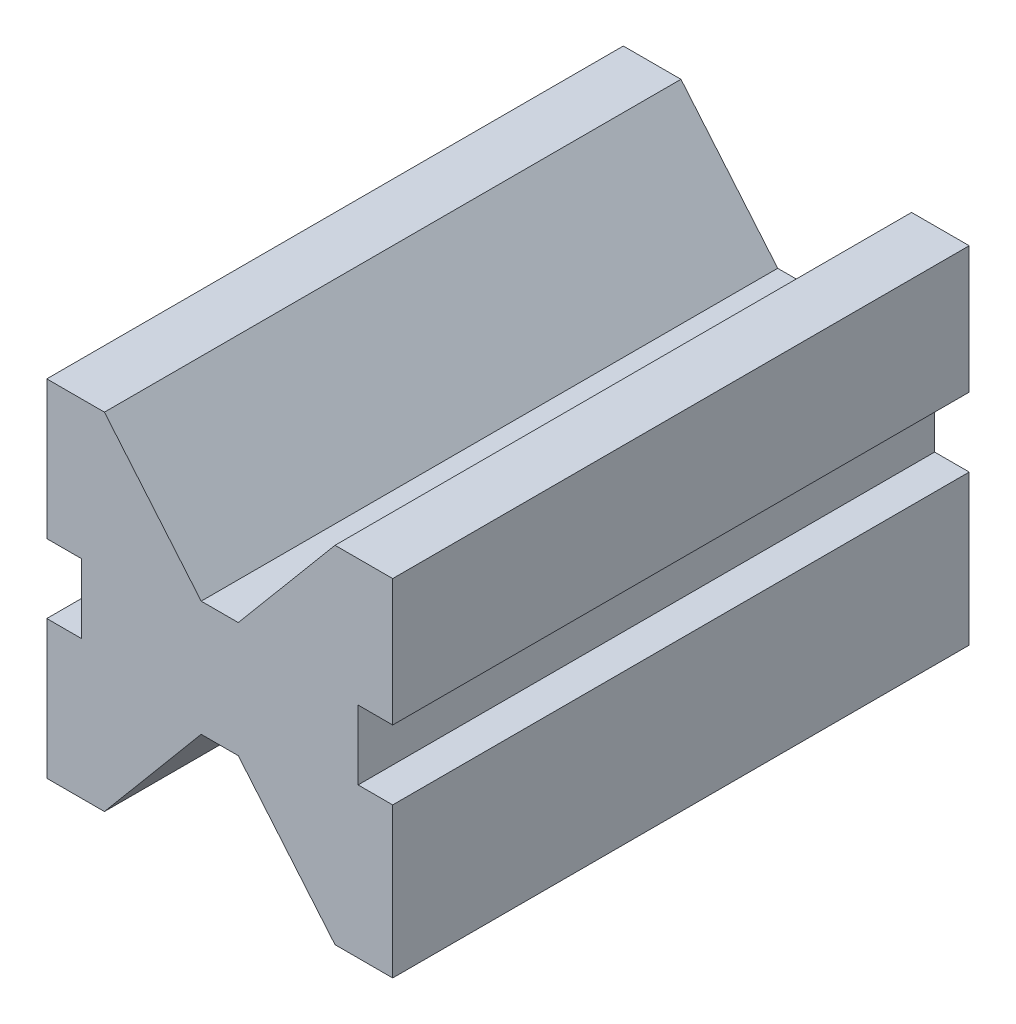
ISO-10303-21;
HEADER;
FILE_DESCRIPTION(('STEP AP214'),'2;1');
FILE_NAME('part.step','',(''),(''),'','','');
FILE_SCHEMA(('AUTOMOTIVE_DESIGN { 1 0 10303 214 1 1 1 1 }'));
ENDSEC;
DATA;
#1=APPLICATION_CONTEXT('core data for automotive mechanical design processes');
#2=APPLICATION_PROTOCOL_DEFINITION('international standard','automotive_design',2000,#1);
#3=PRODUCT_CONTEXT('',#1,'mechanical');
#4=PRODUCT('Part','Part','',(#3));
#5=PRODUCT_RELATED_PRODUCT_CATEGORY('part','',(#4));
#6=PRODUCT_DEFINITION_FORMATION('','',#4);
#7=PRODUCT_DEFINITION_CONTEXT('part definition',#1,'design');
#8=PRODUCT_DEFINITION('design','',#6,#7);
#9=PRODUCT_DEFINITION_SHAPE('','',#8);
#10=(LENGTH_UNIT() NAMED_UNIT(*) SI_UNIT(.MILLI.,.METRE.));
#11=(NAMED_UNIT(*) PLANE_ANGLE_UNIT() SI_UNIT($,.RADIAN.));
#12=(NAMED_UNIT(*) SI_UNIT($,.STERADIAN.) SOLID_ANGLE_UNIT());
#13=UNCERTAINTY_MEASURE_WITH_UNIT(LENGTH_MEASURE(1.E-05),#10,'distance_accuracy_value','');
#14=(GEOMETRIC_REPRESENTATION_CONTEXT(3) GLOBAL_UNCERTAINTY_ASSIGNED_CONTEXT((#13)) GLOBAL_UNIT_ASSIGNED_CONTEXT((#10,
#11,#12)) REPRESENTATION_CONTEXT('',''));
#15=CARTESIAN_POINT('',(0.,0.,0.));
#16=DIRECTION('',(0.,0.,1.));
#17=DIRECTION('',(1.,0.,0.));
#18=AXIS2_PLACEMENT_3D('',#15,#16,#17);
#19=CARTESIAN_POINT('',(0.,0.,100.));
#20=DIRECTION('',(-1.,0.,0.));
#21=DIRECTION('',(0.,0.,1.));
#22=AXIS2_PLACEMENT_3D('',#19,#20,#21);
#23=PLANE('',#22);
#24=DIRECTION('',(0.,1.,0.));
#25=VECTOR('',#24,1.);
#26=CARTESIAN_POINT('',(0.,0.,0.));
#27=LINE('',#26,#25);
#28=CARTESIAN_POINT('',(0.,0.,0.));
#29=VERTEX_POINT('',#28);
#30=CARTESIAN_POINT('',(0.,26.0025547445256,0.));
#31=VERTEX_POINT('',#30);
#32=EDGE_CURVE('E222',#29,#31,#27,.T.);
#33=ORIENTED_EDGE('',*,*,#32,.T.);
#34=DIRECTION('',(0.,0.,-1.));
#35=VECTOR('',#34,1.);
#36=CARTESIAN_POINT('',(0.,26.0025547445256,100.));
#37=LINE('',#36,#35);
#38=CARTESIAN_POINT('',(0.,26.0025547445256,100.));
#39=VERTEX_POINT('',#38);
#40=EDGE_CURVE('E11',#39,#31,#37,.T.);
#41=ORIENTED_EDGE('',*,*,#40,.F.);
#42=DIRECTION('',(0.,1.,0.));
#43=VECTOR('',#42,1.);
#44=CARTESIAN_POINT('',(0.,0.,100.));
#45=LINE('',#44,#43);
#46=CARTESIAN_POINT('',(0.,0.,100.));
#47=VERTEX_POINT('',#46);
#48=EDGE_CURVE('E280',#47,#39,#45,.T.);
#49=ORIENTED_EDGE('',*,*,#48,.F.);
#50=DIRECTION('',(0.,0.,-1.));
#51=VECTOR('',#50,1.);
#52=CARTESIAN_POINT('',(0.,0.,100.));
#53=LINE('',#52,#51);
#54=EDGE_CURVE('E218',#47,#29,#53,.T.);
#55=ORIENTED_EDGE('',*,*,#54,.T.);
#56=EDGE_LOOP('',(#33,#41,#49,#55));
#57=FACE_BOUND('',#56,.T.);
#58=ADVANCED_FACE('F49',(#57),#23,.F.);
#59=CARTESIAN_POINT('',(0.,26.0025547445256,100.));
#60=DIRECTION('',(0.,-1.,0.));
#61=DIRECTION('',(0.,0.,-1.));
#62=AXIS2_PLACEMENT_3D('',#59,#60,#61);
#63=PLANE('',#62);
#64=DIRECTION('',(-1.,0.,0.));
#65=VECTOR('',#64,1.);
#66=CARTESIAN_POINT('',(0.,26.0025547445256,0.));
#67=LINE('',#66,#65);
#68=CARTESIAN_POINT('',(-6.,26.0025547445256,0.));
#69=VERTEX_POINT('',#68);
#70=EDGE_CURVE('E226',#31,#69,#67,.T.);
#71=ORIENTED_EDGE('',*,*,#70,.T.);
#72=DIRECTION('',(0.,0.,-1.));
#73=VECTOR('',#72,1.);
#74=CARTESIAN_POINT('',(-6.,26.0025547445256,100.));
#75=LINE('',#74,#73);
#76=CARTESIAN_POINT('',(-6.,26.0025547445256,100.));
#77=VERTEX_POINT('',#76);
#78=EDGE_CURVE('E58',#77,#69,#75,.T.);
#79=ORIENTED_EDGE('',*,*,#78,.F.);
#80=DIRECTION('',(-1.,0.,0.));
#81=VECTOR('',#80,1.);
#82=CARTESIAN_POINT('',(0.,26.0025547445256,100.));
#83=LINE('',#82,#81);
#84=EDGE_CURVE('E145',#39,#77,#83,.T.);
#85=ORIENTED_EDGE('',*,*,#84,.F.);
#86=ORIENTED_EDGE('',*,*,#40,.T.);
#87=EDGE_LOOP('',(#71,#79,#85,#86));
#88=FACE_BOUND('',#87,.T.);
#89=ADVANCED_FACE('F430',(#88),#63,.F.);
#90=CARTESIAN_POINT('',(-6.,26.0025547445256,100.));
#91=DIRECTION('',(-1.,0.,0.));
#92=DIRECTION('',(0.,0.,1.));
#93=AXIS2_PLACEMENT_3D('',#90,#91,#92);
#94=PLANE('',#93);
#95=DIRECTION('',(0.,1.,0.));
#96=VECTOR('',#95,1.);
#97=CARTESIAN_POINT('',(-6.,26.0025547445256,0.));
#98=LINE('',#97,#96);
#99=CARTESIAN_POINT('',(-6.,38.0025547445255,0.));
#100=VERTEX_POINT('',#99);
#101=EDGE_CURVE('E229',#69,#100,#98,.T.);
#102=ORIENTED_EDGE('',*,*,#101,.T.);
#103=DIRECTION('',(0.,0.,-1.));
#104=VECTOR('',#103,1.);
#105=CARTESIAN_POINT('',(-6.,38.0025547445255,100.));
#106=LINE('',#105,#104);
#107=CARTESIAN_POINT('',(-6.,38.0025547445255,100.));
#108=VERTEX_POINT('',#107);
#109=EDGE_CURVE('E339',#108,#100,#106,.T.);
#110=ORIENTED_EDGE('',*,*,#109,.F.);
#111=DIRECTION('',(0.,1.,0.));
#112=VECTOR('',#111,1.);
#113=CARTESIAN_POINT('',(-6.,26.0025547445256,100.));
#114=LINE('',#113,#112);
#115=EDGE_CURVE('E349',#77,#108,#114,.T.);
#116=ORIENTED_EDGE('',*,*,#115,.F.);
#117=ORIENTED_EDGE('',*,*,#78,.T.);
#118=EDGE_LOOP('',(#102,#110,#116,#117));
#119=FACE_BOUND('',#118,.T.);
#120=ADVANCED_FACE('F347',(#119),#94,.F.);
#121=CARTESIAN_POINT('',(0.,38.0025547445255,100.));
#122=DIRECTION('',(0.,1.,0.));
#123=DIRECTION('',(0.,0.,1.));
#124=AXIS2_PLACEMENT_3D('',#121,#122,#123);
#125=PLANE('',#124);
#126=DIRECTION('',(1.,0.,0.));
#127=VECTOR('',#126,1.);
#128=CARTESIAN_POINT('',(0.,38.0025547445255,0.));
#129=LINE('',#128,#127);
#130=CARTESIAN_POINT('',(0.,38.0025547445255,0.));
#131=VERTEX_POINT('',#130);
#132=EDGE_CURVE('E232',#100,#131,#129,.T.);
#133=ORIENTED_EDGE('',*,*,#132,.T.);
#134=DIRECTION('',(0.,0.,-1.));
#135=VECTOR('',#134,1.);
#136=CARTESIAN_POINT('',(0.,38.0025547445255,100.));
#137=LINE('',#136,#135);
#138=CARTESIAN_POINT('',(0.,38.0025547445255,100.));
#139=VERTEX_POINT('',#138);
#140=EDGE_CURVE('E335',#139,#131,#137,.T.);
#141=ORIENTED_EDGE('',*,*,#140,.F.);
#142=DIRECTION('',(1.,0.,0.));
#143=VECTOR('',#142,1.);
#144=CARTESIAN_POINT('',(0.,38.0025547445255,100.));
#145=LINE('',#144,#143);
#146=EDGE_CURVE('E368',#108,#139,#145,.T.);
#147=ORIENTED_EDGE('',*,*,#146,.F.);
#148=ORIENTED_EDGE('',*,*,#109,.T.);
#149=EDGE_LOOP('',(#133,#141,#147,#148));
#150=FACE_BOUND('',#149,.T.);
#151=ADVANCED_FACE('F358',(#150),#125,.F.);
#152=CARTESIAN_POINT('',(0.,38.0025547445255,100.));
#153=DIRECTION('',(-1.,0.,0.));
#154=DIRECTION('',(0.,0.,1.));
#155=AXIS2_PLACEMENT_3D('',#152,#153,#154);
#156=PLANE('',#155);
#157=DIRECTION('',(0.,1.,0.));
#158=VECTOR('',#157,1.);
#159=CARTESIAN_POINT('',(0.,38.0025547445255,0.));
#160=LINE('',#159,#158);
#161=CARTESIAN_POINT('',(0.,60.,0.));
#162=VERTEX_POINT('',#161);
#163=EDGE_CURVE('E235',#131,#162,#160,.T.);
#164=ORIENTED_EDGE('',*,*,#163,.T.);
#165=DIRECTION('',(0.,0.,-1.));
#166=VECTOR('',#165,1.);
#167=CARTESIAN_POINT('',(0.,60.,100.));
#168=LINE('',#167,#166);
#169=CARTESIAN_POINT('',(0.,60.,100.));
#170=VERTEX_POINT('',#169);
#171=EDGE_CURVE('E331',#170,#162,#168,.T.);
#172=ORIENTED_EDGE('',*,*,#171,.F.);
#173=DIRECTION('',(0.,1.,0.));
#174=VECTOR('',#173,1.);
#175=CARTESIAN_POINT('',(0.,38.0025547445255,100.));
#176=LINE('',#175,#174);
#177=EDGE_CURVE('E364',#139,#170,#176,.T.);
#178=ORIENTED_EDGE('',*,*,#177,.F.);
#179=ORIENTED_EDGE('',*,*,#140,.T.);
#180=EDGE_LOOP('',(#164,#172,#178,#179));
#181=FACE_BOUND('',#180,.T.);
#182=ADVANCED_FACE('F362',(#181),#156,.F.);
#183=CARTESIAN_POINT('',(0.,60.,100.));
#184=DIRECTION('',(0.,-1.,0.));
#185=DIRECTION('',(0.,0.,-1.));
#186=AXIS2_PLACEMENT_3D('',#183,#184,#185);
#187=PLANE('',#186);
#188=DIRECTION('',(-1.,0.,0.));
#189=VECTOR('',#188,1.);
#190=CARTESIAN_POINT('',(0.,60.,0.));
#191=LINE('',#190,#189);
#192=CARTESIAN_POINT('',(-10.,60.,0.));
#193=VERTEX_POINT('',#192);
#194=EDGE_CURVE('E238',#162,#193,#191,.T.);
#195=ORIENTED_EDGE('',*,*,#194,.T.);
#196=DIRECTION('',(0.,0.,-1.));
#197=VECTOR('',#196,1.);
#198=CARTESIAN_POINT('',(-10.,60.,100.));
#199=LINE('',#198,#197);
#200=CARTESIAN_POINT('',(-10.,60.,100.));
#201=VERTEX_POINT('',#200);
#202=EDGE_CURVE('E327',#201,#193,#199,.T.);
#203=ORIENTED_EDGE('',*,*,#202,.F.);
#204=DIRECTION('',(-1.,0.,0.));
#205=VECTOR('',#204,1.);
#206=CARTESIAN_POINT('',(0.,60.,100.));
#207=LINE('',#206,#205);
#208=EDGE_CURVE('E367',#170,#201,#207,.T.);
#209=ORIENTED_EDGE('',*,*,#208,.F.);
#210=ORIENTED_EDGE('',*,*,#171,.T.);
#211=EDGE_LOOP('',(#195,#203,#209,#210));
#212=FACE_BOUND('',#211,.T.);
#213=ADVANCED_FACE('F443',(#212),#187,.F.);
#214=CARTESIAN_POINT('',(-26.7819926235458,40.,100.));
#215=DIRECTION('',(0.766044443118975,-0.642787609686543,0.));
#216=DIRECTION('',(0.642787609686543,0.766044443118975,0.));
#217=AXIS2_PLACEMENT_3D('',#214,#215,#216);
#218=PLANE('',#217);
#219=DIRECTION('',(-0.642787609686543,-0.766044443118975,0.));
#220=VECTOR('',#219,1.);
#221=CARTESIAN_POINT('',(-26.7819926235458,40.,0.));
#222=LINE('',#221,#220);
#223=CARTESIAN_POINT('',(-26.7819926235458,40.,0.));
#224=VERTEX_POINT('',#223);
#225=EDGE_CURVE('E241',#193,#224,#222,.T.);
#226=ORIENTED_EDGE('',*,*,#225,.T.);
#227=DIRECTION('',(0.,0.,-1.));
#228=VECTOR('',#227,1.);
#229=CARTESIAN_POINT('',(-26.7819926235458,40.,100.));
#230=LINE('',#229,#228);
#231=CARTESIAN_POINT('',(-26.7819926235458,40.,100.));
#232=VERTEX_POINT('',#231);
#233=EDGE_CURVE('E323',#232,#224,#230,.T.);
#234=ORIENTED_EDGE('',*,*,#233,.F.);
#235=DIRECTION('',(-0.642787609686543,-0.766044443118975,0.));
#236=VECTOR('',#235,1.);
#237=CARTESIAN_POINT('',(-26.7819926235458,40.,100.));
#238=LINE('',#237,#236);
#239=EDGE_CURVE('E372',#201,#232,#238,.T.);
#240=ORIENTED_EDGE('',*,*,#239,.F.);
#241=ORIENTED_EDGE('',*,*,#202,.T.);
#242=EDGE_LOOP('',(#226,#234,#240,#241));
#243=FACE_BOUND('',#242,.T.);
#244=ADVANCED_FACE('F446',(#243),#218,.F.);
#245=CARTESIAN_POINT('',(-33.2180073764542,40.,100.));
#246=DIRECTION('',(0.,-1.,0.));
#247=DIRECTION('',(0.,0.,-1.));
#248=AXIS2_PLACEMENT_3D('',#245,#246,#247);
#249=PLANE('',#248);
#250=DIRECTION('',(-1.,0.,0.));
#251=VECTOR('',#250,1.);
#252=CARTESIAN_POINT('',(-33.2180073764542,40.,0.));
#253=LINE('',#252,#251);
#254=CARTESIAN_POINT('',(-33.2180073764542,40.,0.));
#255=VERTEX_POINT('',#254);
#256=EDGE_CURVE('E244',#224,#255,#253,.T.);
#257=ORIENTED_EDGE('',*,*,#256,.T.);
#258=DIRECTION('',(0.,0.,-1.));
#259=VECTOR('',#258,1.);
#260=CARTESIAN_POINT('',(-33.2180073764542,40.,100.));
#261=LINE('',#260,#259);
#262=CARTESIAN_POINT('',(-33.2180073764542,40.,100.));
#263=VERTEX_POINT('',#262);
#264=EDGE_CURVE('E319',#263,#255,#261,.T.);
#265=ORIENTED_EDGE('',*,*,#264,.F.);
#266=DIRECTION('',(-1.,0.,0.));
#267=VECTOR('',#266,1.);
#268=CARTESIAN_POINT('',(-33.2180073764542,40.,100.));
#269=LINE('',#268,#267);
#270=EDGE_CURVE('E379',#232,#263,#269,.T.);
#271=ORIENTED_EDGE('',*,*,#270,.F.);
#272=ORIENTED_EDGE('',*,*,#233,.T.);
#273=EDGE_LOOP('',(#257,#265,#271,#272));
#274=FACE_BOUND('',#273,.T.);
#275=ADVANCED_FACE('F450',(#274),#249,.F.);
#276=CARTESIAN_POINT('',(-50.,60.,100.));
#277=DIRECTION('',(-0.766044443118975,-0.642787609686543,0.));
#278=DIRECTION('',(0.642787609686543,-0.766044443118975,0.));
#279=AXIS2_PLACEMENT_3D('',#276,#277,#278);
#280=PLANE('',#279);
#281=DIRECTION('',(-0.642787609686543,0.766044443118975,0.));
#282=VECTOR('',#281,1.);
#283=CARTESIAN_POINT('',(-50.,60.,0.));
#284=LINE('',#283,#282);
#285=CARTESIAN_POINT('',(-50.,60.,0.));
#286=VERTEX_POINT('',#285);
#287=EDGE_CURVE('E247',#255,#286,#284,.T.);
#288=ORIENTED_EDGE('',*,*,#287,.T.);
#289=DIRECTION('',(0.,0.,-1.));
#290=VECTOR('',#289,1.);
#291=CARTESIAN_POINT('',(-50.,60.,100.));
#292=LINE('',#291,#290);
#293=CARTESIAN_POINT('',(-50.,60.,100.));
#294=VERTEX_POINT('',#293);
#295=EDGE_CURVE('E315',#294,#286,#292,.T.);
#296=ORIENTED_EDGE('',*,*,#295,.F.);
#297=DIRECTION('',(-0.642787609686543,0.766044443118975,0.));
#298=VECTOR('',#297,1.);
#299=CARTESIAN_POINT('',(-50.,60.,100.));
#300=LINE('',#299,#298);
#301=EDGE_CURVE('E382',#263,#294,#300,.T.);
#302=ORIENTED_EDGE('',*,*,#301,.F.);
#303=ORIENTED_EDGE('',*,*,#264,.T.);
#304=EDGE_LOOP('',(#288,#296,#302,#303));
#305=FACE_BOUND('',#304,.T.);
#306=ADVANCED_FACE('F454',(#305),#280,.F.);
#307=CARTESIAN_POINT('',(-50.,60.,100.));
#308=DIRECTION('',(0.,-1.,0.));
#309=DIRECTION('',(1.,0.,0.));
#310=AXIS2_PLACEMENT_3D('',#307,#308,#309);
#311=PLANE('',#310);
#312=DIRECTION('',(-1.,0.,0.));
#313=VECTOR('',#312,1.);
#314=CARTESIAN_POINT('',(-50.,60.,0.));
#315=LINE('',#314,#313);
#316=CARTESIAN_POINT('',(-60.,60.,0.));
#317=VERTEX_POINT('',#316);
#318=EDGE_CURVE('E250',#286,#317,#315,.T.);
#319=ORIENTED_EDGE('',*,*,#318,.T.);
#320=DIRECTION('',(0.,0.,-1.));
#321=VECTOR('',#320,1.);
#322=CARTESIAN_POINT('',(-60.,60.,100.));
#323=LINE('',#322,#321);
#324=CARTESIAN_POINT('',(-60.,60.,100.));
#325=VERTEX_POINT('',#324);
#326=EDGE_CURVE('E311',#325,#317,#323,.T.);
#327=ORIENTED_EDGE('',*,*,#326,.F.);
#328=DIRECTION('',(-1.,0.,0.));
#329=VECTOR('',#328,1.);
#330=CARTESIAN_POINT('',(-50.,60.,100.));
#331=LINE('',#330,#329);
#332=EDGE_CURVE('E385',#294,#325,#331,.T.);
#333=ORIENTED_EDGE('',*,*,#332,.F.);
#334=ORIENTED_EDGE('',*,*,#295,.T.);
#335=EDGE_LOOP('',(#319,#327,#333,#334));
#336=FACE_BOUND('',#335,.T.);
#337=ADVANCED_FACE('F458',(#336),#311,.F.);
#338=CARTESIAN_POINT('',(-60.,36.,100.));
#339=DIRECTION('',(1.,0.,0.));
#340=DIRECTION('',(0.,0.,-1.));
#341=AXIS2_PLACEMENT_3D('',#338,#339,#340);
#342=PLANE('',#341);
#343=DIRECTION('',(0.,-1.,0.));
#344=VECTOR('',#343,1.);
#345=CARTESIAN_POINT('',(-60.,36.,0.));
#346=LINE('',#345,#344);
#347=CARTESIAN_POINT('',(-60.,36.,0.));
#348=VERTEX_POINT('',#347);
#349=EDGE_CURVE('E253',#317,#348,#346,.T.);
#350=ORIENTED_EDGE('',*,*,#349,.T.);
#351=DIRECTION('',(0.,0.,-1.));
#352=VECTOR('',#351,1.);
#353=CARTESIAN_POINT('',(-60.,36.,100.));
#354=LINE('',#353,#352);
#355=CARTESIAN_POINT('',(-60.,36.,100.));
#356=VERTEX_POINT('',#355);
#357=EDGE_CURVE('E307',#356,#348,#354,.T.);
#358=ORIENTED_EDGE('',*,*,#357,.F.);
#359=DIRECTION('',(0.,-1.,0.));
#360=VECTOR('',#359,1.);
#361=CARTESIAN_POINT('',(-60.,36.,100.));
#362=LINE('',#361,#360);
#363=EDGE_CURVE('E388',#325,#356,#362,.T.);
#364=ORIENTED_EDGE('',*,*,#363,.F.);
#365=ORIENTED_EDGE('',*,*,#326,.T.);
#366=EDGE_LOOP('',(#350,#358,#364,#365));
#367=FACE_BOUND('',#366,.T.);
#368=ADVANCED_FACE('F462',(#367),#342,.F.);
#369=CARTESIAN_POINT('',(-60.,36.,100.));
#370=DIRECTION('',(0.,1.,0.));
#371=DIRECTION('',(0.,0.,1.));
#372=AXIS2_PLACEMENT_3D('',#369,#370,#371);
#373=PLANE('',#372);
#374=DIRECTION('',(1.,0.,0.));
#375=VECTOR('',#374,1.);
#376=CARTESIAN_POINT('',(-60.,36.,0.));
#377=LINE('',#376,#375);
#378=CARTESIAN_POINT('',(-54.,36.,0.));
#379=VERTEX_POINT('',#378);
#380=EDGE_CURVE('E256',#348,#379,#377,.T.);
#381=ORIENTED_EDGE('',*,*,#380,.T.);
#382=DIRECTION('',(0.,0.,-1.));
#383=VECTOR('',#382,1.);
#384=CARTESIAN_POINT('',(-54.,36.,100.));
#385=LINE('',#384,#383);
#386=CARTESIAN_POINT('',(-54.,36.,100.));
#387=VERTEX_POINT('',#386);
#388=EDGE_CURVE('E303',#387,#379,#385,.T.);
#389=ORIENTED_EDGE('',*,*,#388,.F.);
#390=DIRECTION('',(1.,0.,0.));
#391=VECTOR('',#390,1.);
#392=CARTESIAN_POINT('',(-60.,36.,100.));
#393=LINE('',#392,#391);
#394=EDGE_CURVE('E391',#356,#387,#393,.T.);
#395=ORIENTED_EDGE('',*,*,#394,.F.);
#396=ORIENTED_EDGE('',*,*,#357,.T.);
#397=EDGE_LOOP('',(#381,#389,#395,#396));
#398=FACE_BOUND('',#397,.T.);
#399=ADVANCED_FACE('F466',(#398),#373,.F.);
#400=CARTESIAN_POINT('',(-54.,36.,100.));
#401=DIRECTION('',(1.,0.,0.));
#402=DIRECTION('',(0.,1.,0.));
#403=AXIS2_PLACEMENT_3D('',#400,#401,#402);
#404=PLANE('',#403);
#405=DIRECTION('',(0.,-1.,0.));
#406=VECTOR('',#405,1.);
#407=CARTESIAN_POINT('',(-54.,36.,0.));
#408=LINE('',#407,#406);
#409=CARTESIAN_POINT('',(-54.,24.,0.));
#410=VERTEX_POINT('',#409);
#411=EDGE_CURVE('E259',#379,#410,#408,.T.);
#412=ORIENTED_EDGE('',*,*,#411,.T.);
#413=DIRECTION('',(0.,0.,-1.));
#414=VECTOR('',#413,1.);
#415=CARTESIAN_POINT('',(-54.,24.,100.));
#416=LINE('',#415,#414);
#417=CARTESIAN_POINT('',(-54.,24.,100.));
#418=VERTEX_POINT('',#417);
#419=EDGE_CURVE('E299',#418,#410,#416,.T.);
#420=ORIENTED_EDGE('',*,*,#419,.F.);
#421=DIRECTION('',(0.,-1.,0.));
#422=VECTOR('',#421,1.);
#423=CARTESIAN_POINT('',(-54.,36.,100.));
#424=LINE('',#423,#422);
#425=EDGE_CURVE('E394',#387,#418,#424,.T.);
#426=ORIENTED_EDGE('',*,*,#425,.F.);
#427=ORIENTED_EDGE('',*,*,#388,.T.);
#428=EDGE_LOOP('',(#412,#420,#426,#427));
#429=FACE_BOUND('',#428,.T.);
#430=ADVANCED_FACE('F470',(#429),#404,.F.);
#431=CARTESIAN_POINT('',(-60.,24.,100.));
#432=DIRECTION('',(0.,-1.,0.));
#433=DIRECTION('',(1.,0.,0.));
#434=AXIS2_PLACEMENT_3D('',#431,#432,#433);
#435=PLANE('',#434);
#436=DIRECTION('',(-1.,0.,0.));
#437=VECTOR('',#436,1.);
#438=CARTESIAN_POINT('',(-60.,24.,0.));
#439=LINE('',#438,#437);
#440=CARTESIAN_POINT('',(-60.,24.,0.));
#441=VERTEX_POINT('',#440);
#442=EDGE_CURVE('E262',#410,#441,#439,.T.);
#443=ORIENTED_EDGE('',*,*,#442,.T.);
#444=DIRECTION('',(0.,0.,-1.));
#445=VECTOR('',#444,1.);
#446=CARTESIAN_POINT('',(-60.,24.,100.));
#447=LINE('',#446,#445);
#448=CARTESIAN_POINT('',(-60.,24.,100.));
#449=VERTEX_POINT('',#448);
#450=EDGE_CURVE('E295',#449,#441,#447,.T.);
#451=ORIENTED_EDGE('',*,*,#450,.F.);
#452=DIRECTION('',(-1.,0.,0.));
#453=VECTOR('',#452,1.);
#454=CARTESIAN_POINT('',(-60.,24.,100.));
#455=LINE('',#454,#453);
#456=EDGE_CURVE('E397',#418,#449,#455,.T.);
#457=ORIENTED_EDGE('',*,*,#456,.F.);
#458=ORIENTED_EDGE('',*,*,#419,.T.);
#459=EDGE_LOOP('',(#443,#451,#457,#458));
#460=FACE_BOUND('',#459,.T.);
#461=ADVANCED_FACE('F474',(#460),#435,.F.);
#462=CARTESIAN_POINT('',(-60.,0.,100.));
#463=DIRECTION('',(1.,0.,0.));
#464=DIRECTION('',(0.,0.,-1.));
#465=AXIS2_PLACEMENT_3D('',#462,#463,#464);
#466=PLANE('',#465);
#467=DIRECTION('',(0.,-1.,0.));
#468=VECTOR('',#467,1.);
#469=CARTESIAN_POINT('',(-60.,0.,0.));
#470=LINE('',#469,#468);
#471=CARTESIAN_POINT('',(-60.,0.,0.));
#472=VERTEX_POINT('',#471);
#473=EDGE_CURVE('E265',#441,#472,#470,.T.);
#474=ORIENTED_EDGE('',*,*,#473,.T.);
#475=DIRECTION('',(0.,0.,-1.));
#476=VECTOR('',#475,1.);
#477=CARTESIAN_POINT('',(-60.,0.,100.));
#478=LINE('',#477,#476);
#479=CARTESIAN_POINT('',(-60.,0.,100.));
#480=VERTEX_POINT('',#479);
#481=EDGE_CURVE('E291',#480,#472,#478,.T.);
#482=ORIENTED_EDGE('',*,*,#481,.F.);
#483=DIRECTION('',(0.,-1.,0.));
#484=VECTOR('',#483,1.);
#485=CARTESIAN_POINT('',(-60.,0.,100.));
#486=LINE('',#485,#484);
#487=EDGE_CURVE('E400',#449,#480,#486,.T.);
#488=ORIENTED_EDGE('',*,*,#487,.F.);
#489=ORIENTED_EDGE('',*,*,#450,.T.);
#490=EDGE_LOOP('',(#474,#482,#488,#489));
#491=FACE_BOUND('',#490,.T.);
#492=ADVANCED_FACE('F478',(#491),#466,.F.);
#493=CARTESIAN_POINT('',(-50.,0.,100.));
#494=DIRECTION('',(0.,1.,0.));
#495=DIRECTION('',(-1.,0.,0.));
#496=AXIS2_PLACEMENT_3D('',#493,#494,#495);
#497=PLANE('',#496);
#498=DIRECTION('',(1.,0.,0.));
#499=VECTOR('',#498,1.);
#500=CARTESIAN_POINT('',(-50.,0.,0.));
#501=LINE('',#500,#499);
#502=CARTESIAN_POINT('',(-50.,0.,0.));
#503=VERTEX_POINT('',#502);
#504=EDGE_CURVE('E268',#472,#503,#501,.T.);
#505=ORIENTED_EDGE('',*,*,#504,.T.);
#506=DIRECTION('',(0.,0.,-1.));
#507=VECTOR('',#506,1.);
#508=CARTESIAN_POINT('',(-50.,0.,100.));
#509=LINE('',#508,#507);
#510=CARTESIAN_POINT('',(-50.,0.,100.));
#511=VERTEX_POINT('',#510);
#512=EDGE_CURVE('E287',#511,#503,#509,.T.);
#513=ORIENTED_EDGE('',*,*,#512,.F.);
#514=DIRECTION('',(1.,0.,0.));
#515=VECTOR('',#514,1.);
#516=CARTESIAN_POINT('',(-50.,0.,100.));
#517=LINE('',#516,#515);
#518=EDGE_CURVE('E403',#480,#511,#517,.T.);
#519=ORIENTED_EDGE('',*,*,#518,.F.);
#520=ORIENTED_EDGE('',*,*,#481,.T.);
#521=EDGE_LOOP('',(#505,#513,#519,#520));
#522=FACE_BOUND('',#521,.T.);
#523=ADVANCED_FACE('F411',(#522),#497,.F.);
#524=CARTESIAN_POINT('',(-50.,0.,100.));
#525=DIRECTION('',(-0.766044443118975,0.642787609686543,0.));
#526=DIRECTION('',(-0.642787609686543,-0.766044443118975,0.));
#527=AXIS2_PLACEMENT_3D('',#524,#525,#526);
#528=PLANE('',#527);
#529=DIRECTION('',(0.642787609686543,0.766044443118975,0.));
#530=VECTOR('',#529,1.);
#531=CARTESIAN_POINT('',(-50.,0.,0.));
#532=LINE('',#531,#530);
#533=CARTESIAN_POINT('',(-33.2180073764542,20.,0.));
#534=VERTEX_POINT('',#533);
#535=EDGE_CURVE('E271',#503,#534,#532,.T.);
#536=ORIENTED_EDGE('',*,*,#535,.T.);
#537=DIRECTION('',(0.,0.,-1.));
#538=VECTOR('',#537,1.);
#539=CARTESIAN_POINT('',(-33.2180073764542,20.,100.));
#540=LINE('',#539,#538);
#541=CARTESIAN_POINT('',(-33.2180073764542,20.,100.));
#542=VERTEX_POINT('',#541);
#543=EDGE_CURVE('E211',#542,#534,#540,.T.);
#544=ORIENTED_EDGE('',*,*,#543,.F.);
#545=DIRECTION('',(0.642787609686543,0.766044443118975,0.));
#546=VECTOR('',#545,1.);
#547=CARTESIAN_POINT('',(-50.,0.,100.));
#548=LINE('',#547,#546);
#549=EDGE_CURVE('E200',#511,#542,#548,.T.);
#550=ORIENTED_EDGE('',*,*,#549,.F.);
#551=ORIENTED_EDGE('',*,*,#512,.T.);
#552=EDGE_LOOP('',(#536,#544,#550,#551));
#553=FACE_BOUND('',#552,.T.);
#554=ADVANCED_FACE('F415',(#553),#528,.F.);
#555=CARTESIAN_POINT('',(-33.2180073764542,20.,100.));
#556=DIRECTION('',(0.,1.,0.));
#557=DIRECTION('',(0.,0.,1.));
#558=AXIS2_PLACEMENT_3D('',#555,#556,#557);
#559=PLANE('',#558);
#560=DIRECTION('',(1.,0.,0.));
#561=VECTOR('',#560,1.);
#562=CARTESIAN_POINT('',(-33.2180073764542,20.,0.));
#563=LINE('',#562,#561);
#564=CARTESIAN_POINT('',(-26.7819926235458,20.,0.));
#565=VERTEX_POINT('',#564);
#566=EDGE_CURVE('E209',#534,#565,#563,.T.);
#567=ORIENTED_EDGE('',*,*,#566,.T.);
#568=DIRECTION('',(0.,0.,-1.));
#569=VECTOR('',#568,1.);
#570=CARTESIAN_POINT('',(-26.7819926235458,20.,100.));
#571=LINE('',#570,#569);
#572=CARTESIAN_POINT('',(-26.7819926235458,20.,100.));
#573=VERTEX_POINT('',#572);
#574=EDGE_CURVE('E206',#573,#565,#571,.T.);
#575=ORIENTED_EDGE('',*,*,#574,.F.);
#576=DIRECTION('',(1.,0.,0.));
#577=VECTOR('',#576,1.);
#578=CARTESIAN_POINT('',(-33.2180073764542,20.,100.));
#579=LINE('',#578,#577);
#580=EDGE_CURVE('E194',#542,#573,#579,.T.);
#581=ORIENTED_EDGE('',*,*,#580,.F.);
#582=ORIENTED_EDGE('',*,*,#543,.T.);
#583=EDGE_LOOP('',(#567,#575,#581,#582));
#584=FACE_BOUND('',#583,.T.);
#585=ADVANCED_FACE('F207',(#584),#559,.F.);
#586=CARTESIAN_POINT('',(-26.7819926235458,20.,100.));
#587=DIRECTION('',(0.766044443118975,0.642787609686543,0.));
#588=DIRECTION('',(-0.642787609686543,0.766044443118975,0.));
#589=AXIS2_PLACEMENT_3D('',#586,#587,#588);
#590=PLANE('',#589);
#591=DIRECTION('',(0.642787609686543,-0.766044443118975,0.));
#592=VECTOR('',#591,1.);
#593=CARTESIAN_POINT('',(-26.7819926235458,20.,0.));
#594=LINE('',#593,#592);
#595=CARTESIAN_POINT('',(-10.,0.,0.));
#596=VERTEX_POINT('',#595);
#597=EDGE_CURVE('E131',#565,#596,#594,.T.);
#598=ORIENTED_EDGE('',*,*,#597,.T.);
#599=DIRECTION('',(0.,0.,-1.));
#600=VECTOR('',#599,1.);
#601=CARTESIAN_POINT('',(-10.,0.,100.));
#602=LINE('',#601,#600);
#603=CARTESIAN_POINT('',(-10.,0.,100.));
#604=VERTEX_POINT('',#603);
#605=EDGE_CURVE('E212',#604,#596,#602,.T.);
#606=ORIENTED_EDGE('',*,*,#605,.F.);
#607=DIRECTION('',(0.642787609686543,-0.766044443118975,0.));
#608=VECTOR('',#607,1.);
#609=CARTESIAN_POINT('',(-26.7819926235458,20.,100.));
#610=LINE('',#609,#608);
#611=EDGE_CURVE('E198',#573,#604,#610,.T.);
#612=ORIENTED_EDGE('',*,*,#611,.F.);
#613=ORIENTED_EDGE('',*,*,#574,.T.);
#614=EDGE_LOOP('',(#598,#606,#612,#613));
#615=FACE_BOUND('',#614,.T.);
#616=ADVANCED_FACE('F214',(#615),#590,.F.);
#617=CARTESIAN_POINT('',(0.,0.,100.));
#618=DIRECTION('',(0.,1.,0.));
#619=DIRECTION('',(-1.,0.,0.));
#620=AXIS2_PLACEMENT_3D('',#617,#618,#619);
#621=PLANE('',#620);
#622=DIRECTION('',(1.,0.,0.));
#623=VECTOR('',#622,1.);
#624=CARTESIAN_POINT('',(0.,0.,0.));
#625=LINE('',#624,#623);
#626=EDGE_CURVE('E137',#596,#29,#625,.T.);
#627=ORIENTED_EDGE('',*,*,#626,.T.);
#628=ORIENTED_EDGE('',*,*,#54,.F.);
#629=DIRECTION('',(1.,0.,0.));
#630=VECTOR('',#629,1.);
#631=CARTESIAN_POINT('',(0.,0.,100.));
#632=LINE('',#631,#630);
#633=EDGE_CURVE('E66',#604,#47,#632,.T.);
#634=ORIENTED_EDGE('',*,*,#633,.F.);
#635=ORIENTED_EDGE('',*,*,#605,.T.);
#636=EDGE_LOOP('',(#627,#628,#634,#635));
#637=FACE_BOUND('',#636,.T.);
#638=ADVANCED_FACE('F419',(#637),#621,.F.);
#639=CARTESIAN_POINT('',(0.,0.,100.));
#640=DIRECTION('',(0.,0.,1.));
#641=DIRECTION('',(1.,0.,0.));
#642=AXIS2_PLACEMENT_3D('',#639,#640,#641);
#643=PLANE('',#642);
#644=ORIENTED_EDGE('',*,*,#48,.T.);
#645=ORIENTED_EDGE('',*,*,#84,.T.);
#646=ORIENTED_EDGE('',*,*,#115,.T.);
#647=ORIENTED_EDGE('',*,*,#146,.T.);
#648=ORIENTED_EDGE('',*,*,#177,.T.);
#649=ORIENTED_EDGE('',*,*,#208,.T.);
#650=ORIENTED_EDGE('',*,*,#239,.T.);
#651=ORIENTED_EDGE('',*,*,#270,.T.);
#652=ORIENTED_EDGE('',*,*,#301,.T.);
#653=ORIENTED_EDGE('',*,*,#332,.T.);
#654=ORIENTED_EDGE('',*,*,#363,.T.);
#655=ORIENTED_EDGE('',*,*,#394,.T.);
#656=ORIENTED_EDGE('',*,*,#425,.T.);
#657=ORIENTED_EDGE('',*,*,#456,.T.);
#658=ORIENTED_EDGE('',*,*,#487,.T.);
#659=ORIENTED_EDGE('',*,*,#518,.T.);
#660=ORIENTED_EDGE('',*,*,#549,.T.);
#661=ORIENTED_EDGE('',*,*,#580,.T.);
#662=ORIENTED_EDGE('',*,*,#611,.T.);
#663=ORIENTED_EDGE('',*,*,#633,.T.);
#664=EDGE_LOOP('',(#644,#645,#646,#647,#648,#649,#650,#651,#652,#653,#654,#655,#656,#657,#658,
#659,#660,#661,#662,#663));
#665=FACE_BOUND('',#664,.T.);
#666=ADVANCED_FACE('F196',(#665),#643,.T.);
#667=CARTESIAN_POINT('',(0.,0.,0.));
#668=DIRECTION('',(0.,0.,1.));
#669=DIRECTION('',(1.,0.,0.));
#670=AXIS2_PLACEMENT_3D('',#667,#668,#669);
#671=PLANE('',#670);
#672=ORIENTED_EDGE('',*,*,#32,.F.);
#673=ORIENTED_EDGE('',*,*,#626,.F.);
#674=ORIENTED_EDGE('',*,*,#597,.F.);
#675=ORIENTED_EDGE('',*,*,#566,.F.);
#676=ORIENTED_EDGE('',*,*,#535,.F.);
#677=ORIENTED_EDGE('',*,*,#504,.F.);
#678=ORIENTED_EDGE('',*,*,#473,.F.);
#679=ORIENTED_EDGE('',*,*,#442,.F.);
#680=ORIENTED_EDGE('',*,*,#411,.F.);
#681=ORIENTED_EDGE('',*,*,#380,.F.);
#682=ORIENTED_EDGE('',*,*,#349,.F.);
#683=ORIENTED_EDGE('',*,*,#318,.F.);
#684=ORIENTED_EDGE('',*,*,#287,.F.);
#685=ORIENTED_EDGE('',*,*,#256,.F.);
#686=ORIENTED_EDGE('',*,*,#225,.F.);
#687=ORIENTED_EDGE('',*,*,#194,.F.);
#688=ORIENTED_EDGE('',*,*,#163,.F.);
#689=ORIENTED_EDGE('',*,*,#132,.F.);
#690=ORIENTED_EDGE('',*,*,#101,.F.);
#691=ORIENTED_EDGE('',*,*,#70,.F.);
#692=EDGE_LOOP('',(#672,#673,#674,#675,#676,#677,#678,#679,#680,#681,#682,#683,#684,#685,#686,
#687,#688,#689,#690,#691));
#693=FACE_BOUND('',#692,.T.);
#694=ADVANCED_FACE('F353',(#693),#671,.F.);
#695=CLOSED_SHELL('',(#58,#89,#120,#151,#182,#213,#244,#275,#306,#337,#368,#399,#430,#461,#492,
#523,#554,#585,#616,#638,#666,#694));
#696=MANIFOLD_SOLID_BREP('B2',#695);
#697=ADVANCED_BREP_SHAPE_REPRESENTATION('',(#18,#696),#14);
#698=SHAPE_DEFINITION_REPRESENTATION(#9,#697);
ENDSEC;
END-ISO-10303-21;
